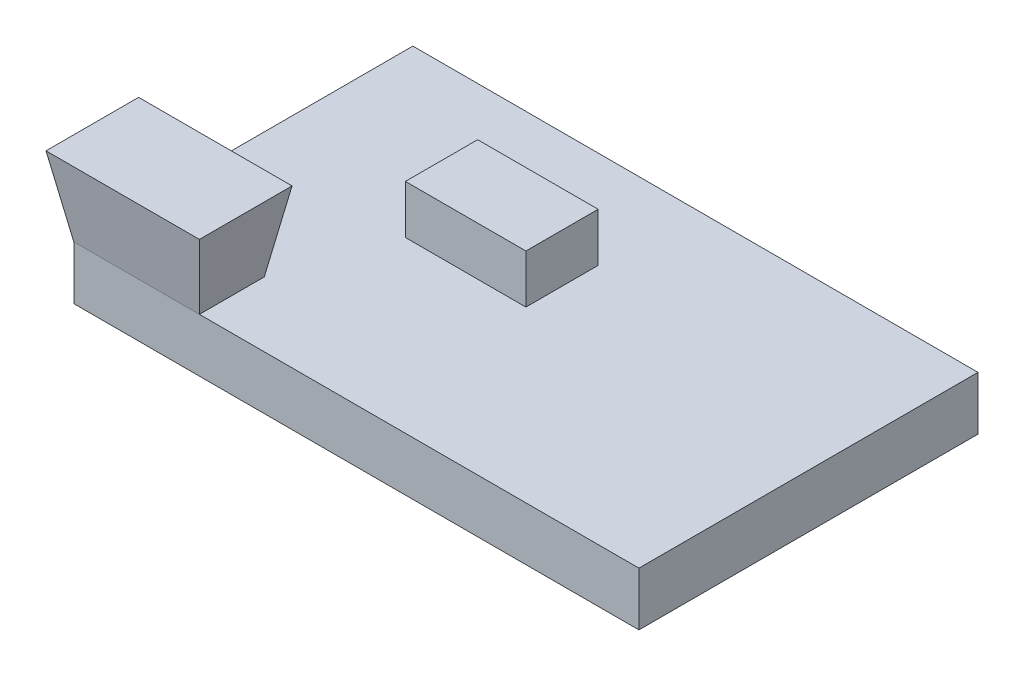
ISO-10303-21;
HEADER;
FILE_DESCRIPTION(('STEP AP214'),'2;1');
FILE_NAME('part.step','',(''),(''),'','','');
FILE_SCHEMA(('AUTOMOTIVE_DESIGN { 1 0 10303 214 1 1 1 1 }'));
ENDSEC;
DATA;
#1=APPLICATION_CONTEXT('core data for automotive mechanical design processes');
#2=APPLICATION_PROTOCOL_DEFINITION('international standard','automotive_design',2000,#1);
#3=PRODUCT_CONTEXT('',#1,'mechanical');
#4=PRODUCT('Part','Part','',(#3));
#5=PRODUCT_RELATED_PRODUCT_CATEGORY('part','',(#4));
#6=PRODUCT_DEFINITION_FORMATION('','',#4);
#7=PRODUCT_DEFINITION_CONTEXT('part definition',#1,'design');
#8=PRODUCT_DEFINITION('design','',#6,#7);
#9=PRODUCT_DEFINITION_SHAPE('','',#8);
#10=(LENGTH_UNIT() NAMED_UNIT(*) SI_UNIT(.MILLI.,.METRE.));
#11=(NAMED_UNIT(*) PLANE_ANGLE_UNIT() SI_UNIT($,.RADIAN.));
#12=(NAMED_UNIT(*) SI_UNIT($,.STERADIAN.) SOLID_ANGLE_UNIT());
#13=UNCERTAINTY_MEASURE_WITH_UNIT(LENGTH_MEASURE(1.E-05),#10,'distance_accuracy_value','');
#14=(GEOMETRIC_REPRESENTATION_CONTEXT(3) GLOBAL_UNCERTAINTY_ASSIGNED_CONTEXT((#13)) GLOBAL_UNIT_ASSIGNED_CONTEXT((#10,
#11,#12)) REPRESENTATION_CONTEXT('',''));
#15=CARTESIAN_POINT('',(0.,0.,0.));
#16=DIRECTION('',(0.,0.,1.));
#17=DIRECTION('',(1.,0.,0.));
#18=AXIS2_PLACEMENT_3D('',#15,#16,#17);
#19=CARTESIAN_POINT('',(0.,240.614231140738,0.));
#20=DIRECTION('',(0.,-1.,0.));
#21=DIRECTION('',(0.,0.,-1.));
#22=AXIS2_PLACEMENT_3D('',#19,#20,#21);
#23=PLANE('',#22);
#24=DIRECTION('',(0.,0.,1.));
#25=VECTOR('',#24,1.);
#26=CARTESIAN_POINT('',(-1270.,240.614231140738,-762.));
#27=LINE('',#26,#25);
#28=CARTESIAN_POINT('',(-1270.,240.614231140738,-762.));
#29=VERTEX_POINT('',#28);
#30=CARTESIAN_POINT('',(-1270.,240.614231140738,470.680450535772));
#31=VERTEX_POINT('',#30);
#32=EDGE_CURVE('E201',#29,#31,#27,.T.);
#33=ORIENTED_EDGE('',*,*,#32,.T.);
#34=DIRECTION('',(1.,0.,0.));
#35=VECTOR('',#34,1.);
#36=CARTESIAN_POINT('',(0.,240.614231140738,470.680450535772));
#37=LINE('',#36,#35);
#38=CARTESIAN_POINT('',(-705.354040797318,240.614231140738,470.680450535772));
#39=VERTEX_POINT('',#38);
#40=EDGE_CURVE('E154',#31,#39,#37,.T.);
#41=ORIENTED_EDGE('',*,*,#40,.T.);
#42=DIRECTION('',(0.,0.,-1.));
#43=VECTOR('',#42,1.);
#44=CARTESIAN_POINT('',(-705.354040797318,240.614231140738,0.));
#45=LINE('',#44,#43);
#46=CARTESIAN_POINT('',(-705.354040797317,240.614231140738,762.));
#47=VERTEX_POINT('',#46);
#48=EDGE_CURVE('E158',#47,#39,#45,.T.);
#49=ORIENTED_EDGE('',*,*,#48,.F.);
#50=DIRECTION('',(1.,0.,0.));
#51=VECTOR('',#50,1.);
#52=CARTESIAN_POINT('',(1270.,240.614231140738,762.));
#53=LINE('',#52,#51);
#54=CARTESIAN_POINT('',(1270.,240.614231140738,762.));
#55=VERTEX_POINT('',#54);
#56=EDGE_CURVE('E205',#47,#55,#53,.T.);
#57=ORIENTED_EDGE('',*,*,#56,.T.);
#58=DIRECTION('',(0.,0.,-1.));
#59=VECTOR('',#58,1.);
#60=CARTESIAN_POINT('',(1270.,240.614231140738,-762.));
#61=LINE('',#60,#59);
#62=CARTESIAN_POINT('',(1270.,240.614231140738,-762.));
#63=VERTEX_POINT('',#62);
#64=EDGE_CURVE('E211',#55,#63,#61,.T.);
#65=ORIENTED_EDGE('',*,*,#64,.T.);
#66=DIRECTION('',(-1.,0.,0.));
#67=VECTOR('',#66,1.);
#68=CARTESIAN_POINT('',(1270.,240.614231140738,-762.));
#69=LINE('',#68,#67);
#70=EDGE_CURVE('E214',#63,#29,#69,.T.);
#71=ORIENTED_EDGE('',*,*,#70,.T.);
#72=EDGE_LOOP('',(#33,#41,#49,#57,#65,#71));
#73=FACE_BOUND('',#72,.T.);
#74=DIRECTION('',(0.,0.,-1.));
#75=VECTOR('',#74,1.);
#76=CARTESIAN_POINT('',(0.,240.614231140738,0.));
#77=LINE('',#76,#75);
#78=CARTESIAN_POINT('',(0.,240.614231140738,0.));
#79=VERTEX_POINT('',#78);
#80=CARTESIAN_POINT('',(0.,240.614231140738,-324.683710248815));
#81=VERTEX_POINT('',#80);
#82=EDGE_CURVE('E152',#79,#81,#77,.T.);
#83=ORIENTED_EDGE('',*,*,#82,.F.);
#84=DIRECTION('',(1.,0.,0.));
#85=VECTOR('',#84,1.);
#86=CARTESIAN_POINT('',(0.,240.614231140738,0.));
#87=LINE('',#86,#85);
#88=CARTESIAN_POINT('',(-541.610093670118,240.614231140738,0.));
#89=VERTEX_POINT('',#88);
#90=EDGE_CURVE('E149',#89,#79,#87,.T.);
#91=ORIENTED_EDGE('',*,*,#90,.F.);
#92=DIRECTION('',(0.,0.,1.));
#93=VECTOR('',#92,1.);
#94=CARTESIAN_POINT('',(-541.610093670118,240.614231140738,0.));
#95=LINE('',#94,#93);
#96=CARTESIAN_POINT('',(-541.610093670118,240.614231140738,-324.683710248815));
#97=VERTEX_POINT('',#96);
#98=EDGE_CURVE('E64',#97,#89,#95,.T.);
#99=ORIENTED_EDGE('',*,*,#98,.F.);
#100=DIRECTION('',(-1.,0.,0.));
#101=VECTOR('',#100,1.);
#102=CARTESIAN_POINT('',(0.,240.614231140738,-324.683710248815));
#103=LINE('',#102,#101);
#104=EDGE_CURVE('E59',#81,#97,#103,.T.);
#105=ORIENTED_EDGE('',*,*,#104,.F.);
#106=EDGE_LOOP('',(#83,#91,#99,#105));
#107=FACE_BOUND('',#106,.T.);
#108=ADVANCED_FACE('F43',(#73,#107),#23,.F.);
#109=CARTESIAN_POINT('',(-1270.,240.614231140738,-762.));
#110=DIRECTION('',(1.,0.,0.));
#111=DIRECTION('',(0.,0.,-1.));
#112=AXIS2_PLACEMENT_3D('',#109,#110,#111);
#113=PLANE('',#112);
#114=DIRECTION('',(0.,0.,1.));
#115=VECTOR('',#114,1.);
#116=CARTESIAN_POINT('',(-1270.,0.,-762.));
#117=LINE('',#116,#115);
#118=CARTESIAN_POINT('',(-1270.,0.,-762.));
#119=VERTEX_POINT('',#118);
#120=CARTESIAN_POINT('',(-1270.,0.,762.));
#121=VERTEX_POINT('',#120);
#122=EDGE_CURVE('E176',#119,#121,#117,.T.);
#123=ORIENTED_EDGE('',*,*,#122,.T.);
#124=DIRECTION('',(0.,-1.,0.));
#125=VECTOR('',#124,1.);
#126=CARTESIAN_POINT('',(-1270.,240.614231140738,762.));
#127=LINE('',#126,#125);
#128=CARTESIAN_POINT('',(-1270.,240.614231140738,762.));
#129=VERTEX_POINT('',#128);
#130=EDGE_CURVE('E11',#129,#121,#127,.T.);
#131=ORIENTED_EDGE('',*,*,#130,.F.);
#132=DIRECTION('',(0.,0.,1.));
#133=VECTOR('',#132,1.);
#134=CARTESIAN_POINT('',(-1270.,240.614231140738,0.));
#135=LINE('',#134,#133);
#136=EDGE_CURVE('E167',#31,#129,#135,.T.);
#137=ORIENTED_EDGE('',*,*,#136,.F.);
#138=ORIENTED_EDGE('',*,*,#32,.F.);
#139=DIRECTION('',(0.,-1.,0.));
#140=VECTOR('',#139,1.);
#141=CARTESIAN_POINT('',(-1270.,240.614231140738,-762.));
#142=LINE('',#141,#140);
#143=EDGE_CURVE('E217',#29,#119,#142,.T.);
#144=ORIENTED_EDGE('',*,*,#143,.T.);
#145=EDGE_LOOP('',(#123,#131,#137,#138,#144));
#146=FACE_BOUND('',#145,.T.);
#147=ADVANCED_FACE('F45',(#146),#113,.F.);
#148=CARTESIAN_POINT('',(1270.,240.614231140738,762.));
#149=DIRECTION('',(0.,0.,-1.));
#150=DIRECTION('',(-1.,0.,0.));
#151=AXIS2_PLACEMENT_3D('',#148,#149,#150);
#152=PLANE('',#151);
#153=DIRECTION('',(1.,0.,0.));
#154=VECTOR('',#153,1.);
#155=CARTESIAN_POINT('',(1270.,0.,762.));
#156=LINE('',#155,#154);
#157=CARTESIAN_POINT('',(1270.,0.,762.));
#158=VERTEX_POINT('',#157);
#159=EDGE_CURVE('E221',#121,#158,#156,.T.);
#160=ORIENTED_EDGE('',*,*,#159,.T.);
#161=DIRECTION('',(0.,-1.,0.));
#162=VECTOR('',#161,1.);
#163=CARTESIAN_POINT('',(1270.,240.614231140738,762.));
#164=LINE('',#163,#162);
#165=EDGE_CURVE('E52',#55,#158,#164,.T.);
#166=ORIENTED_EDGE('',*,*,#165,.F.);
#167=ORIENTED_EDGE('',*,*,#56,.F.);
#168=EDGE_CURVE('E207',#129,#47,#53,.T.);
#169=ORIENTED_EDGE('',*,*,#168,.F.);
#170=ORIENTED_EDGE('',*,*,#130,.T.);
#171=EDGE_LOOP('',(#160,#166,#167,#169,#170));
#172=FACE_BOUND('',#171,.T.);
#173=ADVANCED_FACE('F270',(#172),#152,.F.);
#174=CARTESIAN_POINT('',(1270.,240.614231140738,-762.));
#175=DIRECTION('',(-1.,0.,0.));
#176=DIRECTION('',(0.,0.,1.));
#177=AXIS2_PLACEMENT_3D('',#174,#175,#176);
#178=PLANE('',#177);
#179=DIRECTION('',(0.,0.,-1.));
#180=VECTOR('',#179,1.);
#181=CARTESIAN_POINT('',(1270.,0.,-762.));
#182=LINE('',#181,#180);
#183=CARTESIAN_POINT('',(1270.,0.,-762.));
#184=VERTEX_POINT('',#183);
#185=EDGE_CURVE('E224',#158,#184,#182,.T.);
#186=ORIENTED_EDGE('',*,*,#185,.T.);
#187=DIRECTION('',(0.,-1.,0.));
#188=VECTOR('',#187,1.);
#189=CARTESIAN_POINT('',(1270.,240.614231140738,-762.));
#190=LINE('',#189,#188);
#191=EDGE_CURVE('E232',#63,#184,#190,.T.);
#192=ORIENTED_EDGE('',*,*,#191,.F.);
#193=ORIENTED_EDGE('',*,*,#64,.F.);
#194=ORIENTED_EDGE('',*,*,#165,.T.);
#195=EDGE_LOOP('',(#186,#192,#193,#194));
#196=FACE_BOUND('',#195,.T.);
#197=ADVANCED_FACE('F241',(#196),#178,.F.);
#198=CARTESIAN_POINT('',(1270.,240.614231140738,-762.));
#199=DIRECTION('',(0.,0.,1.));
#200=DIRECTION('',(1.,0.,0.));
#201=AXIS2_PLACEMENT_3D('',#198,#199,#200);
#202=PLANE('',#201);
#203=DIRECTION('',(-1.,0.,0.));
#204=VECTOR('',#203,1.);
#205=CARTESIAN_POINT('',(1270.,0.,-762.));
#206=LINE('',#205,#204);
#207=EDGE_CURVE('E206',#184,#119,#206,.T.);
#208=ORIENTED_EDGE('',*,*,#207,.T.);
#209=ORIENTED_EDGE('',*,*,#143,.F.);
#210=ORIENTED_EDGE('',*,*,#70,.F.);
#211=ORIENTED_EDGE('',*,*,#191,.T.);
#212=EDGE_LOOP('',(#208,#209,#210,#211));
#213=FACE_BOUND('',#212,.T.);
#214=ADVANCED_FACE('F251',(#213),#202,.F.);
#215=CARTESIAN_POINT('',(0.,0.,0.));
#216=DIRECTION('',(0.,-1.,0.));
#217=DIRECTION('',(0.,0.,-1.));
#218=AXIS2_PLACEMENT_3D('',#215,#216,#217);
#219=PLANE('',#218);
#220=ORIENTED_EDGE('',*,*,#122,.F.);
#221=ORIENTED_EDGE('',*,*,#207,.F.);
#222=ORIENTED_EDGE('',*,*,#185,.F.);
#223=ORIENTED_EDGE('',*,*,#159,.F.);
#224=EDGE_LOOP('',(#220,#221,#222,#223));
#225=FACE_BOUND('',#224,.T.);
#226=ADVANCED_FACE('F248',(#225),#219,.T.);
#227=CARTESIAN_POINT('',(0.,240.614231140738,470.680450535772));
#228=DIRECTION('',(0.,-0.173648177666931,-0.984807753012208));
#229=DIRECTION('',(0.,0.984807753012208,-0.173648177666931));
#230=AXIS2_PLACEMENT_3D('',#227,#228,#229);
#231=PLANE('',#230);
#232=ORIENTED_EDGE('',*,*,#40,.F.);
#233=DIRECTION('',(-0.171087869746036,0.970287525247814,-0.171087869746036));
#234=VECTOR('',#233,1.);
#235=CARTESIAN_POINT('',(-1232.82575484872,29.7886104562699,507.854695687052));
#236=LINE('',#235,#234);
#237=CARTESIAN_POINT('',(-1332.47793907443,594.944231140737,408.202511461341));
#238=VERTEX_POINT('',#237);
#239=EDGE_CURVE('E172',#238,#31,#236,.F.);
#240=ORIENTED_EDGE('',*,*,#239,.F.);
#241=DIRECTION('',(1.,0.,0.));
#242=VECTOR('',#241,1.);
#243=CARTESIAN_POINT('',(0.,594.944231140737,408.202511461341));
#244=LINE('',#243,#242);
#245=CARTESIAN_POINT('',(-642.876101722887,594.944231140737,408.202511461341));
#246=VERTEX_POINT('',#245);
#247=EDGE_CURVE('E171',#238,#246,#244,.T.);
#248=ORIENTED_EDGE('',*,*,#247,.T.);
#249=DIRECTION('',(0.171087869746036,0.970287525247814,-0.171087869746036));
#250=VECTOR('',#249,1.);
#251=CARTESIAN_POINT('',(-691.576725477529,318.749269036997,456.903135215983));
#252=LINE('',#251,#250);
#253=EDGE_CURVE('E178',#246,#39,#252,.F.);
#254=ORIENTED_EDGE('',*,*,#253,.T.);
#255=EDGE_LOOP('',(#232,#240,#248,#254));
#256=FACE_BOUND('',#255,.T.);
#257=ADVANCED_FACE('F264',(#256),#231,.T.);
#258=CARTESIAN_POINT('',(-1270.,240.614231140738,0.));
#259=DIRECTION('',(-0.984807753012208,-0.173648177666931,0.));
#260=DIRECTION('',(0.173648177666931,-0.984807753012208,0.));
#261=AXIS2_PLACEMENT_3D('',#258,#259,#260);
#262=PLANE('',#261);
#263=ORIENTED_EDGE('',*,*,#136,.T.);
#264=DIRECTION('',(0.171087869746036,-0.970287525247814,-0.171087869746036));
#265=VECTOR('',#264,1.);
#266=CARTESIAN_POINT('',(-1232.82575484872,29.7886104562698,724.82575484872));
#267=LINE('',#266,#265);
#268=CARTESIAN_POINT('',(-1332.47793907443,594.944231140737,824.477939074431));
#269=VERTEX_POINT('',#268);
#270=EDGE_CURVE('E177',#269,#129,#267,.T.);
#271=ORIENTED_EDGE('',*,*,#270,.F.);
#272=DIRECTION('',(0.,0.,-1.));
#273=VECTOR('',#272,1.);
#274=CARTESIAN_POINT('',(-1332.47793907443,594.944231140737,0.));
#275=LINE('',#274,#273);
#276=EDGE_CURVE('E183',#238,#269,#275,.F.);
#277=ORIENTED_EDGE('',*,*,#276,.F.);
#278=ORIENTED_EDGE('',*,*,#239,.T.);
#279=EDGE_LOOP('',(#263,#271,#277,#278));
#280=FACE_BOUND('',#279,.T.);
#281=ADVANCED_FACE('F260',(#280),#262,.T.);
#282=CARTESIAN_POINT('',(1.33226762955019E-13,240.614231140738,762.));
#283=DIRECTION('',(0.,-0.173648177666931,0.984807753012208));
#284=DIRECTION('',(0.,-0.984807753012208,-0.173648177666931));
#285=AXIS2_PLACEMENT_3D('',#282,#283,#284);
#286=PLANE('',#285);
#287=ORIENTED_EDGE('',*,*,#168,.T.);
#288=DIRECTION('',(-0.171087869746036,-0.970287525247814,-0.171087869746036));
#289=VECTOR('',#288,1.);
#290=CARTESIAN_POINT('',(-727.658587888086,114.118858730057,739.695452909232));
#291=LINE('',#290,#289);
#292=CARTESIAN_POINT('',(-642.876101722887,594.944231140737,824.477939074431));
#293=VERTEX_POINT('',#292);
#294=EDGE_CURVE('E182',#293,#47,#291,.T.);
#295=ORIENTED_EDGE('',*,*,#294,.F.);
#296=DIRECTION('',(-1.,0.,0.));
#297=VECTOR('',#296,1.);
#298=CARTESIAN_POINT('',(1.4415029783558E-13,594.944231140737,824.47793907443));
#299=LINE('',#298,#297);
#300=EDGE_CURVE('E196',#269,#293,#299,.F.);
#301=ORIENTED_EDGE('',*,*,#300,.F.);
#302=ORIENTED_EDGE('',*,*,#270,.T.);
#303=EDGE_LOOP('',(#287,#295,#301,#302));
#304=FACE_BOUND('',#303,.T.);
#305=ADVANCED_FACE('F273',(#304),#286,.T.);
#306=CARTESIAN_POINT('',(-705.354040797318,240.614231140738,0.));
#307=DIRECTION('',(0.984807753012208,-0.173648177666931,0.));
#308=DIRECTION('',(0.173648177666931,0.984807753012208,0.));
#309=AXIS2_PLACEMENT_3D('',#306,#307,#308);
#310=PLANE('',#309);
#311=ORIENTED_EDGE('',*,*,#48,.T.);
#312=ORIENTED_EDGE('',*,*,#253,.F.);
#313=DIRECTION('',(0.,0.,1.));
#314=VECTOR('',#313,1.);
#315=CARTESIAN_POINT('',(-642.876101722887,594.944231140737,0.));
#316=LINE('',#315,#314);
#317=EDGE_CURVE('E193',#293,#246,#316,.F.);
#318=ORIENTED_EDGE('',*,*,#317,.F.);
#319=ORIENTED_EDGE('',*,*,#294,.T.);
#320=EDGE_LOOP('',(#311,#312,#318,#319));
#321=FACE_BOUND('',#320,.T.);
#322=ADVANCED_FACE('F268',(#321),#310,.T.);
#323=CARTESIAN_POINT('',(0.,594.944231140737,0.));
#324=DIRECTION('',(0.,1.,0.));
#325=DIRECTION('',(0.,0.,1.));
#326=AXIS2_PLACEMENT_3D('',#323,#324,#325);
#327=PLANE('',#326);
#328=ORIENTED_EDGE('',*,*,#247,.F.);
#329=ORIENTED_EDGE('',*,*,#276,.T.);
#330=ORIENTED_EDGE('',*,*,#300,.T.);
#331=ORIENTED_EDGE('',*,*,#317,.T.);
#332=EDGE_LOOP('',(#328,#329,#330,#331));
#333=FACE_BOUND('',#332,.T.);
#334=ADVANCED_FACE('F276',(#333),#327,.T.);
#335=CARTESIAN_POINT('',(0.,459.054231140738,0.));
#336=DIRECTION('',(-1.,0.,0.));
#337=DIRECTION('',(0.,0.,1.));
#338=AXIS2_PLACEMENT_3D('',#335,#336,#337);
#339=PLANE('',#338);
#340=ORIENTED_EDGE('',*,*,#82,.T.);
#341=DIRECTION('',(0.,-1.,0.));
#342=VECTOR('',#341,1.);
#343=CARTESIAN_POINT('',(0.,459.054231140738,-324.683710248815));
#344=LINE('',#343,#342);
#345=CARTESIAN_POINT('',(0.,459.054231140738,-324.683710248815));
#346=VERTEX_POINT('',#345);
#347=EDGE_CURVE('E131',#346,#81,#344,.T.);
#348=ORIENTED_EDGE('',*,*,#347,.F.);
#349=DIRECTION('',(0.,0.,-1.));
#350=VECTOR('',#349,1.);
#351=CARTESIAN_POINT('',(0.,459.054231140738,0.));
#352=LINE('',#351,#350);
#353=CARTESIAN_POINT('',(0.,459.054231140738,0.));
#354=VERTEX_POINT('',#353);
#355=EDGE_CURVE('E139',#354,#346,#352,.T.);
#356=ORIENTED_EDGE('',*,*,#355,.F.);
#357=DIRECTION('',(0.,-1.,0.));
#358=VECTOR('',#357,1.);
#359=CARTESIAN_POINT('',(0.,459.054231140738,0.));
#360=LINE('',#359,#358);
#361=EDGE_CURVE('E403',#354,#79,#360,.T.);
#362=ORIENTED_EDGE('',*,*,#361,.T.);
#363=EDGE_LOOP('',(#340,#348,#356,#362));
#364=FACE_BOUND('',#363,.T.);
#365=ADVANCED_FACE('F151',(#364),#339,.F.);
#366=CARTESIAN_POINT('',(0.,459.054231140738,-324.683710248815));
#367=DIRECTION('',(0.,0.,1.));
#368=DIRECTION('',(1.,0.,0.));
#369=AXIS2_PLACEMENT_3D('',#366,#367,#368);
#370=PLANE('',#369);
#371=ORIENTED_EDGE('',*,*,#104,.T.);
#372=DIRECTION('',(0.,-1.,0.));
#373=VECTOR('',#372,1.);
#374=CARTESIAN_POINT('',(-541.610093670118,459.054231140738,-324.683710248815));
#375=LINE('',#374,#373);
#376=CARTESIAN_POINT('',(-541.610093670118,459.054231140738,-324.683710248815));
#377=VERTEX_POINT('',#376);
#378=EDGE_CURVE('E134',#377,#97,#375,.T.);
#379=ORIENTED_EDGE('',*,*,#378,.F.);
#380=DIRECTION('',(-1.,0.,0.));
#381=VECTOR('',#380,1.);
#382=CARTESIAN_POINT('',(0.,459.054231140738,-324.683710248815));
#383=LINE('',#382,#381);
#384=EDGE_CURVE('E127',#346,#377,#383,.T.);
#385=ORIENTED_EDGE('',*,*,#384,.F.);
#386=ORIENTED_EDGE('',*,*,#347,.T.);
#387=EDGE_LOOP('',(#371,#379,#385,#386));
#388=FACE_BOUND('',#387,.T.);
#389=ADVANCED_FACE('F129',(#388),#370,.F.);
#390=CARTESIAN_POINT('',(-541.610093670118,459.054231140738,0.));
#391=DIRECTION('',(1.,0.,0.));
#392=DIRECTION('',(0.,0.,-1.));
#393=AXIS2_PLACEMENT_3D('',#390,#391,#392);
#394=PLANE('',#393);
#395=ORIENTED_EDGE('',*,*,#98,.T.);
#396=DIRECTION('',(0.,-1.,0.));
#397=VECTOR('',#396,1.);
#398=CARTESIAN_POINT('',(-541.610093670118,459.054231140738,0.));
#399=LINE('',#398,#397);
#400=CARTESIAN_POINT('',(-541.610093670118,459.054231140738,0.));
#401=VERTEX_POINT('',#400);
#402=EDGE_CURVE('E160',#401,#89,#399,.T.);
#403=ORIENTED_EDGE('',*,*,#402,.F.);
#404=DIRECTION('',(0.,0.,1.));
#405=VECTOR('',#404,1.);
#406=CARTESIAN_POINT('',(-541.610093670118,459.054231140738,0.));
#407=LINE('',#406,#405);
#408=EDGE_CURVE('E138',#377,#401,#407,.T.);
#409=ORIENTED_EDGE('',*,*,#408,.F.);
#410=ORIENTED_EDGE('',*,*,#378,.T.);
#411=EDGE_LOOP('',(#395,#403,#409,#410));
#412=FACE_BOUND('',#411,.T.);
#413=ADVANCED_FACE('F361',(#412),#394,.F.);
#414=CARTESIAN_POINT('',(0.,459.054231140738,0.));
#415=DIRECTION('',(0.,0.,-1.));
#416=DIRECTION('',(-1.,0.,0.));
#417=AXIS2_PLACEMENT_3D('',#414,#415,#416);
#418=PLANE('',#417);
#419=ORIENTED_EDGE('',*,*,#90,.T.);
#420=ORIENTED_EDGE('',*,*,#361,.F.);
#421=DIRECTION('',(1.,0.,0.));
#422=VECTOR('',#421,1.);
#423=CARTESIAN_POINT('',(0.,459.054231140738,0.));
#424=LINE('',#423,#422);
#425=EDGE_CURVE('E144',#401,#354,#424,.T.);
#426=ORIENTED_EDGE('',*,*,#425,.F.);
#427=ORIENTED_EDGE('',*,*,#402,.T.);
#428=EDGE_LOOP('',(#419,#420,#426,#427));
#429=FACE_BOUND('',#428,.T.);
#430=ADVANCED_FACE('F371',(#429),#418,.F.);
#431=CARTESIAN_POINT('',(0.,459.054231140738,0.));
#432=DIRECTION('',(0.,1.,0.));
#433=DIRECTION('',(0.,0.,1.));
#434=AXIS2_PLACEMENT_3D('',#431,#432,#433);
#435=PLANE('',#434);
#436=ORIENTED_EDGE('',*,*,#355,.T.);
#437=ORIENTED_EDGE('',*,*,#384,.T.);
#438=ORIENTED_EDGE('',*,*,#408,.T.);
#439=ORIENTED_EDGE('',*,*,#425,.T.);
#440=EDGE_LOOP('',(#436,#437,#438,#439));
#441=FACE_BOUND('',#440,.T.);
#442=ADVANCED_FACE('F142',(#441),#435,.T.);
#443=CLOSED_SHELL('',(#108,#147,#173,#197,#214,#226,#257,#281,#305,#322,#334,#365,#389,#413,
#430,#442));
#444=MANIFOLD_SOLID_BREP('B2',#443);
#445=ADVANCED_BREP_SHAPE_REPRESENTATION('',(#18,#444),#14);
#446=SHAPE_DEFINITION_REPRESENTATION(#9,#445);
ENDSEC;
END-ISO-10303-21;
